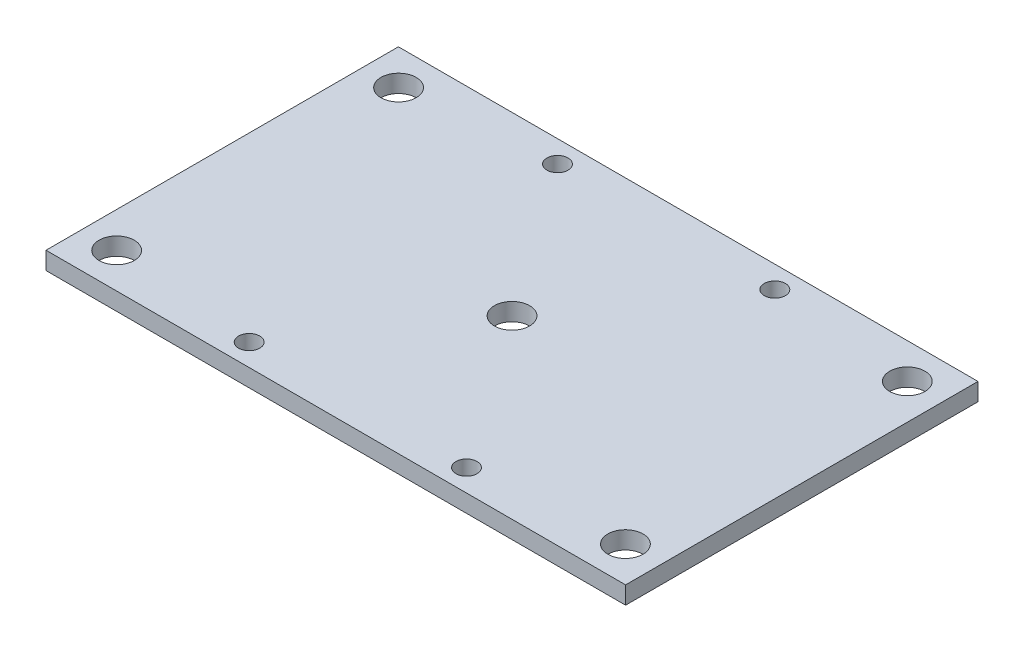
ISO-10303-21;
HEADER;
FILE_DESCRIPTION(('STEP AP214'),'2;1');
FILE_NAME('part.step','',(''),(''),'','','');
FILE_SCHEMA(('AUTOMOTIVE_DESIGN { 1 0 10303 214 1 1 1 1 }'));
ENDSEC;
DATA;
#1=APPLICATION_CONTEXT('core data for automotive mechanical design processes');
#2=APPLICATION_PROTOCOL_DEFINITION('international standard','automotive_design',2000,#1);
#3=PRODUCT_CONTEXT('',#1,'mechanical');
#4=PRODUCT('Part','Part','',(#3));
#5=PRODUCT_RELATED_PRODUCT_CATEGORY('part','',(#4));
#6=PRODUCT_DEFINITION_FORMATION('','',#4);
#7=PRODUCT_DEFINITION_CONTEXT('part definition',#1,'design');
#8=PRODUCT_DEFINITION('design','',#6,#7);
#9=PRODUCT_DEFINITION_SHAPE('','',#8);
#10=(LENGTH_UNIT() NAMED_UNIT(*) SI_UNIT(.MILLI.,.METRE.));
#11=(NAMED_UNIT(*) PLANE_ANGLE_UNIT() SI_UNIT($,.RADIAN.));
#12=(NAMED_UNIT(*) SI_UNIT($,.STERADIAN.) SOLID_ANGLE_UNIT());
#13=UNCERTAINTY_MEASURE_WITH_UNIT(LENGTH_MEASURE(1.E-05),#10,'distance_accuracy_value','');
#14=(GEOMETRIC_REPRESENTATION_CONTEXT(3) GLOBAL_UNCERTAINTY_ASSIGNED_CONTEXT((#13)) GLOBAL_UNIT_ASSIGNED_CONTEXT((#10,
#11,#12)) REPRESENTATION_CONTEXT('',''));
#15=CARTESIAN_POINT('',(0.,0.,0.));
#16=DIRECTION('',(0.,0.,1.));
#17=DIRECTION('',(1.,0.,0.));
#18=AXIS2_PLACEMENT_3D('',#15,#16,#17);
#19=CARTESIAN_POINT('',(0.,5.,0.));
#20=DIRECTION('',(0.,-1.,0.));
#21=DIRECTION('',(0.,0.,-1.));
#22=AXIS2_PLACEMENT_3D('',#19,#20,#21);
#23=PLANE('',#22);
#24=CARTESIAN_POINT('',(-30.8390624999998,5.,43.7499999999999));
#25=DIRECTION('',(0.,1.,0.));
#26=DIRECTION('',(0.,0.,-1.));
#27=AXIS2_PLACEMENT_3D('',#24,#25,#26);
#28=CIRCLE('',#27,3.);
#29=CARTESIAN_POINT('',(-30.8390624999998,5.,46.7499999999999));
#30=VERTEX_POINT('',#29);
#31=EDGE_CURVE('E157',#30,#30,#28,.T.);
#32=ORIENTED_EDGE('',*,*,#31,.F.);
#33=EDGE_LOOP('',(#32));
#34=FACE_BOUND('',#33,.T.);
#35=CARTESIAN_POINT('',(30.8390625,5.,43.7499999999998));
#36=DIRECTION('',(0.,1.,0.));
#37=DIRECTION('',(0.,0.,1.));
#38=AXIS2_PLACEMENT_3D('',#35,#36,#37);
#39=CIRCLE('',#38,3.);
#40=CARTESIAN_POINT('',(30.8390625,5.,46.7499999999998));
#41=VERTEX_POINT('',#40);
#42=EDGE_CURVE('E151',#41,#41,#39,.T.);
#43=ORIENTED_EDGE('',*,*,#42,.F.);
#44=EDGE_LOOP('',(#43));
#45=FACE_BOUND('',#44,.T.);
#46=CARTESIAN_POINT('',(30.8390625,5.,-43.7499999999998));
#47=DIRECTION('',(0.,1.,0.));
#48=DIRECTION('',(0.,0.,-1.));
#49=AXIS2_PLACEMENT_3D('',#46,#47,#48);
#50=CIRCLE('',#49,3.);
#51=CARTESIAN_POINT('',(30.8390625,5.,-40.7499999999998));
#52=VERTEX_POINT('',#51);
#53=EDGE_CURVE('E145',#52,#52,#50,.T.);
#54=ORIENTED_EDGE('',*,*,#53,.F.);
#55=EDGE_LOOP('',(#54));
#56=FACE_BOUND('',#55,.T.);
#57=CARTESIAN_POINT('',(-30.8390624999998,5.,-43.7499999999999));
#58=DIRECTION('',(0.,1.,0.));
#59=DIRECTION('',(0.,0.,1.));
#60=AXIS2_PLACEMENT_3D('',#57,#58,#59);
#61=CIRCLE('',#60,3.);
#62=CARTESIAN_POINT('',(-30.8390624999998,5.,-40.7499999999999));
#63=VERTEX_POINT('',#62);
#64=EDGE_CURVE('E139',#63,#63,#61,.T.);
#65=ORIENTED_EDGE('',*,*,#64,.F.);
#66=EDGE_LOOP('',(#65));
#67=FACE_BOUND('',#66,.T.);
#68=DIRECTION('',(1.,0.,0.));
#69=VECTOR('',#68,1.);
#70=CARTESIAN_POINT('',(-90.2374999999999,5.,50.));
#71=LINE('',#70,#69);
#72=CARTESIAN_POINT('',(-82.2374999999999,5.,50.));
#73=VERTEX_POINT('',#72);
#74=CARTESIAN_POINT('',(82.2374999999998,5.,50.));
#75=VERTEX_POINT('',#74);
#76=EDGE_CURVE('E11',#73,#75,#71,.T.);
#77=ORIENTED_EDGE('',*,*,#76,.T.);
#78=DIRECTION('',(0.,0.,1.));
#79=VECTOR('',#78,1.);
#80=CARTESIAN_POINT('',(82.2375000000001,5.,-49.9999999999998));
#81=LINE('',#80,#79);
#82=CARTESIAN_POINT('',(82.2375000000001,5.,-49.9999999999998));
#83=VERTEX_POINT('',#82);
#84=EDGE_CURVE('E50',#83,#75,#81,.T.);
#85=ORIENTED_EDGE('',*,*,#84,.F.);
#86=DIRECTION('',(-1.,0.,0.));
#87=VECTOR('',#86,1.);
#88=CARTESIAN_POINT('',(-90.2374999999999,5.,-50.));
#89=LINE('',#88,#87);
#90=CARTESIAN_POINT('',(-82.2374999999999,5.,-50.));
#91=VERTEX_POINT('',#90);
#92=EDGE_CURVE('E42',#83,#91,#89,.T.);
#93=ORIENTED_EDGE('',*,*,#92,.T.);
#94=DIRECTION('',(0.,0.,-1.));
#95=VECTOR('',#94,1.);
#96=CARTESIAN_POINT('',(-82.2374999999999,5.,-50.));
#97=LINE('',#96,#95);
#98=EDGE_CURVE('E129',#73,#91,#97,.T.);
#99=ORIENTED_EDGE('',*,*,#98,.F.);
#100=EDGE_LOOP('',(#77,#85,#93,#99));
#101=FACE_BOUND('',#100,.T.);
#102=CARTESIAN_POINT('',(-72.19,5.,-40.));
#103=DIRECTION('',(0.,1.,0.));
#104=DIRECTION('',(0.,0.,1.));
#105=AXIS2_PLACEMENT_3D('',#102,#103,#104);
#106=CIRCLE('',#105,5.00000000000001);
#107=CARTESIAN_POINT('',(-72.19,5.,-35.));
#108=VERTEX_POINT('',#107);
#109=EDGE_CURVE('E94',#108,#108,#106,.T.);
#110=ORIENTED_EDGE('',*,*,#109,.F.);
#111=EDGE_LOOP('',(#110));
#112=FACE_BOUND('',#111,.T.);
#113=CARTESIAN_POINT('',(72.19,5.,-40.));
#114=DIRECTION('',(0.,1.,0.));
#115=DIRECTION('',(0.,0.,-1.));
#116=AXIS2_PLACEMENT_3D('',#113,#114,#115);
#117=CIRCLE('',#116,5.00000000000001);
#118=CARTESIAN_POINT('',(72.19,5.,-45.));
#119=VERTEX_POINT('',#118);
#120=EDGE_CURVE('E102',#119,#119,#117,.T.);
#121=ORIENTED_EDGE('',*,*,#120,.F.);
#122=EDGE_LOOP('',(#121));
#123=FACE_BOUND('',#122,.T.);
#124=CARTESIAN_POINT('',(72.19,5.,40.));
#125=DIRECTION('',(0.,1.,0.));
#126=DIRECTION('',(0.,0.,1.));
#127=AXIS2_PLACEMENT_3D('',#124,#125,#126);
#128=CIRCLE('',#127,5.00000000000001);
#129=CARTESIAN_POINT('',(72.19,5.,45.));
#130=VERTEX_POINT('',#129);
#131=EDGE_CURVE('E107',#130,#130,#128,.T.);
#132=ORIENTED_EDGE('',*,*,#131,.F.);
#133=EDGE_LOOP('',(#132));
#134=FACE_BOUND('',#133,.T.);
#135=CARTESIAN_POINT('',(-72.19,5.,40.));
#136=DIRECTION('',(0.,1.,0.));
#137=DIRECTION('',(0.,0.,-1.));
#138=AXIS2_PLACEMENT_3D('',#135,#136,#137);
#139=CIRCLE('',#138,5.00000000000001);
#140=CARTESIAN_POINT('',(-72.19,5.,35.));
#141=VERTEX_POINT('',#140);
#142=EDGE_CURVE('E113',#141,#141,#139,.T.);
#143=ORIENTED_EDGE('',*,*,#142,.F.);
#144=EDGE_LOOP('',(#143));
#145=FACE_BOUND('',#144,.T.);
#146=CARTESIAN_POINT('',(0.,5.,0.));
#147=DIRECTION('',(0.,1.,0.));
#148=DIRECTION('',(0.,0.,1.));
#149=AXIS2_PLACEMENT_3D('',#146,#147,#148);
#150=CIRCLE('',#149,5.);
#151=CARTESIAN_POINT('',(0.,5.,4.99999999999999));
#152=VERTEX_POINT('',#151);
#153=EDGE_CURVE('E119',#152,#152,#150,.T.);
#154=ORIENTED_EDGE('',*,*,#153,.F.);
#155=EDGE_LOOP('',(#154));
#156=FACE_BOUND('',#155,.T.);
#157=ADVANCED_FACE('F33',(#34,#45,#56,#67,#101,#112,#123,#134,#145,#156),#23,.F.);
#158=CARTESIAN_POINT('',(0.,0.,0.));
#159=DIRECTION('',(0.,-1.,0.));
#160=DIRECTION('',(0.,0.,-1.));
#161=AXIS2_PLACEMENT_3D('',#158,#159,#160);
#162=PLANE('',#161);
#163=CARTESIAN_POINT('',(-30.8390624999998,0.,43.7499999999999));
#164=DIRECTION('',(0.,-1.,0.));
#165=DIRECTION('',(0.,0.,-1.));
#166=AXIS2_PLACEMENT_3D('',#163,#164,#165);
#167=CIRCLE('',#166,3.);
#168=CARTESIAN_POINT('',(-30.8390624999998,0.,46.7499999999999));
#169=VERTEX_POINT('',#168);
#170=EDGE_CURVE('E154',#169,#169,#167,.F.);
#171=ORIENTED_EDGE('',*,*,#170,.T.);
#172=EDGE_LOOP('',(#171));
#173=FACE_BOUND('',#172,.T.);
#174=CARTESIAN_POINT('',(30.8390625,0.,43.7499999999998));
#175=DIRECTION('',(0.,-1.,0.));
#176=DIRECTION('',(0.,0.,-1.));
#177=AXIS2_PLACEMENT_3D('',#174,#175,#176);
#178=CIRCLE('',#177,3.);
#179=CARTESIAN_POINT('',(30.8390625,0.,46.7499999999998));
#180=VERTEX_POINT('',#179);
#181=EDGE_CURVE('E148',#180,#180,#178,.F.);
#182=ORIENTED_EDGE('',*,*,#181,.T.);
#183=EDGE_LOOP('',(#182));
#184=FACE_BOUND('',#183,.T.);
#185=CARTESIAN_POINT('',(30.8390625,0.,-43.7499999999998));
#186=DIRECTION('',(0.,-1.,0.));
#187=DIRECTION('',(0.,0.,-1.));
#188=AXIS2_PLACEMENT_3D('',#185,#186,#187);
#189=CIRCLE('',#188,3.);
#190=CARTESIAN_POINT('',(30.8390625,0.,-40.7499999999998));
#191=VERTEX_POINT('',#190);
#192=EDGE_CURVE('E142',#191,#191,#189,.F.);
#193=ORIENTED_EDGE('',*,*,#192,.T.);
#194=EDGE_LOOP('',(#193));
#195=FACE_BOUND('',#194,.T.);
#196=CARTESIAN_POINT('',(-30.8390624999998,0.,-43.7499999999999));
#197=DIRECTION('',(0.,-1.,0.));
#198=DIRECTION('',(0.,0.,-1.));
#199=AXIS2_PLACEMENT_3D('',#196,#197,#198);
#200=CIRCLE('',#199,3.);
#201=CARTESIAN_POINT('',(-30.8390624999998,0.,-40.7499999999999));
#202=VERTEX_POINT('',#201);
#203=EDGE_CURVE('E136',#202,#202,#200,.F.);
#204=ORIENTED_EDGE('',*,*,#203,.T.);
#205=EDGE_LOOP('',(#204));
#206=FACE_BOUND('',#205,.T.);
#207=DIRECTION('',(0.,0.,1.));
#208=VECTOR('',#207,1.);
#209=CARTESIAN_POINT('',(82.2375000000001,0.,-49.9999999999998));
#210=LINE('',#209,#208);
#211=CARTESIAN_POINT('',(82.2375000000001,0.,-49.9999999999998));
#212=VERTEX_POINT('',#211);
#213=CARTESIAN_POINT('',(82.2374999999998,0.,50.0000000000002));
#214=VERTEX_POINT('',#213);
#215=EDGE_CURVE('E77',#212,#214,#210,.T.);
#216=ORIENTED_EDGE('',*,*,#215,.T.);
#217=DIRECTION('',(1.,0.,0.));
#218=VECTOR('',#217,1.);
#219=CARTESIAN_POINT('',(-90.2374999999999,0.,50.));
#220=LINE('',#219,#218);
#221=CARTESIAN_POINT('',(-82.2374999999999,0.,50.));
#222=VERTEX_POINT('',#221);
#223=EDGE_CURVE('E37',#222,#214,#220,.T.);
#224=ORIENTED_EDGE('',*,*,#223,.F.);
#225=DIRECTION('',(0.,0.,-1.));
#226=VECTOR('',#225,1.);
#227=CARTESIAN_POINT('',(-82.2374999999999,0.,-50.));
#228=LINE('',#227,#226);
#229=CARTESIAN_POINT('',(-82.2374999999999,0.,-50.));
#230=VERTEX_POINT('',#229);
#231=EDGE_CURVE('E58',#222,#230,#228,.T.);
#232=ORIENTED_EDGE('',*,*,#231,.T.);
#233=DIRECTION('',(-1.,0.,0.));
#234=VECTOR('',#233,1.);
#235=CARTESIAN_POINT('',(-90.2374999999999,0.,-50.));
#236=LINE('',#235,#234);
#237=EDGE_CURVE('E89',#212,#230,#236,.T.);
#238=ORIENTED_EDGE('',*,*,#237,.F.);
#239=EDGE_LOOP('',(#216,#224,#232,#238));
#240=FACE_BOUND('',#239,.T.);
#241=CARTESIAN_POINT('',(-72.19,0.,40.));
#242=DIRECTION('',(0.,1.,0.));
#243=DIRECTION('',(0.,0.,-1.));
#244=AXIS2_PLACEMENT_3D('',#241,#242,#243);
#245=CIRCLE('',#244,5.00000000000001);
#246=CARTESIAN_POINT('',(-72.19,0.,35.));
#247=VERTEX_POINT('',#246);
#248=EDGE_CURVE('E116',#247,#247,#245,.T.);
#249=ORIENTED_EDGE('',*,*,#248,.T.);
#250=EDGE_LOOP('',(#249));
#251=FACE_BOUND('',#250,.T.);
#252=CARTESIAN_POINT('',(72.19,0.,-40.));
#253=DIRECTION('',(0.,1.,0.));
#254=DIRECTION('',(0.,0.,-1.));
#255=AXIS2_PLACEMENT_3D('',#252,#253,#254);
#256=CIRCLE('',#255,5.00000000000001);
#257=CARTESIAN_POINT('',(72.19,0.,-45.));
#258=VERTEX_POINT('',#257);
#259=EDGE_CURVE('E104',#258,#258,#256,.T.);
#260=ORIENTED_EDGE('',*,*,#259,.T.);
#261=EDGE_LOOP('',(#260));
#262=FACE_BOUND('',#261,.T.);
#263=CARTESIAN_POINT('',(-72.19,0.,-40.));
#264=DIRECTION('',(0.,1.,0.));
#265=DIRECTION('',(0.,0.,1.));
#266=AXIS2_PLACEMENT_3D('',#263,#264,#265);
#267=CIRCLE('',#266,5.00000000000001);
#268=CARTESIAN_POINT('',(-72.19,0.,-35.));
#269=VERTEX_POINT('',#268);
#270=EDGE_CURVE('E98',#269,#269,#267,.T.);
#271=ORIENTED_EDGE('',*,*,#270,.T.);
#272=EDGE_LOOP('',(#271));
#273=FACE_BOUND('',#272,.T.);
#274=CARTESIAN_POINT('',(72.19,0.,40.));
#275=DIRECTION('',(0.,1.,0.));
#276=DIRECTION('',(0.,0.,1.));
#277=AXIS2_PLACEMENT_3D('',#274,#275,#276);
#278=CIRCLE('',#277,5.00000000000001);
#279=CARTESIAN_POINT('',(72.19,0.,45.));
#280=VERTEX_POINT('',#279);
#281=EDGE_CURVE('E110',#280,#280,#278,.T.);
#282=ORIENTED_EDGE('',*,*,#281,.T.);
#283=EDGE_LOOP('',(#282));
#284=FACE_BOUND('',#283,.T.);
#285=CARTESIAN_POINT('',(0.,0.,0.));
#286=DIRECTION('',(0.,1.,0.));
#287=DIRECTION('',(0.,0.,1.));
#288=AXIS2_PLACEMENT_3D('',#285,#286,#287);
#289=CIRCLE('',#288,5.);
#290=CARTESIAN_POINT('',(0.,0.,4.99999999999999));
#291=VERTEX_POINT('',#290);
#292=EDGE_CURVE('E122',#291,#291,#289,.T.);
#293=ORIENTED_EDGE('',*,*,#292,.T.);
#294=EDGE_LOOP('',(#293));
#295=FACE_BOUND('',#294,.T.);
#296=ADVANCED_FACE('F87',(#173,#184,#195,#206,#240,#251,#262,#273,#284,#295),#162,.T.);
#297=CARTESIAN_POINT('',(-90.2374999999999,5.,-50.));
#298=DIRECTION('',(0.,0.,1.));
#299=DIRECTION('',(1.,0.,0.));
#300=AXIS2_PLACEMENT_3D('',#297,#298,#299);
#301=PLANE('',#300);
#302=ORIENTED_EDGE('',*,*,#92,.F.);
#303=DIRECTION('',(0.,1.,0.));
#304=VECTOR('',#303,1.);
#305=CARTESIAN_POINT('',(82.2375000000001,-100.319489631876,-49.9999999999998));
#306=LINE('',#305,#304);
#307=EDGE_CURVE('E82',#212,#83,#306,.T.);
#308=ORIENTED_EDGE('',*,*,#307,.F.);
#309=ORIENTED_EDGE('',*,*,#237,.T.);
#310=DIRECTION('',(0.,1.,0.));
#311=VECTOR('',#310,1.);
#312=CARTESIAN_POINT('',(-82.2374999999999,-100.319489631876,-50.));
#313=LINE('',#312,#311);
#314=EDGE_CURVE('E125',#230,#91,#313,.T.);
#315=ORIENTED_EDGE('',*,*,#314,.T.);
#316=EDGE_LOOP('',(#302,#308,#309,#315));
#317=FACE_BOUND('',#316,.T.);
#318=ADVANCED_FACE('F35',(#317),#301,.F.);
#319=CARTESIAN_POINT('',(-90.2374999999999,5.,50.));
#320=DIRECTION('',(0.,0.,-1.));
#321=DIRECTION('',(-1.,0.,0.));
#322=AXIS2_PLACEMENT_3D('',#319,#320,#321);
#323=PLANE('',#322);
#324=ORIENTED_EDGE('',*,*,#223,.T.);
#325=DIRECTION('',(0.,1.,0.));
#326=VECTOR('',#325,1.);
#327=CARTESIAN_POINT('',(82.2374999999998,-100.319489631876,50.0000000000002));
#328=LINE('',#327,#326);
#329=EDGE_CURVE('E74',#214,#75,#328,.T.);
#330=ORIENTED_EDGE('',*,*,#329,.T.);
#331=ORIENTED_EDGE('',*,*,#76,.F.);
#332=DIRECTION('',(0.,1.,0.));
#333=VECTOR('',#332,1.);
#334=CARTESIAN_POINT('',(-82.2374999999999,-100.319489631876,50.));
#335=LINE('',#334,#333);
#336=EDGE_CURVE('E92',#222,#73,#335,.T.);
#337=ORIENTED_EDGE('',*,*,#336,.F.);
#338=EDGE_LOOP('',(#324,#330,#331,#337));
#339=FACE_BOUND('',#338,.T.);
#340=ADVANCED_FACE('F91',(#339),#323,.F.);
#341=CARTESIAN_POINT('',(-72.19,5.,-40.));
#342=DIRECTION('',(0.,-1.,0.));
#343=DIRECTION('',(0.,0.,-1.));
#344=AXIS2_PLACEMENT_3D('',#341,#342,#343);
#345=CYLINDRICAL_SURFACE('',#344,5.00000000000001);
#346=ORIENTED_EDGE('',*,*,#109,.T.);
#347=EDGE_LOOP('',(#346));
#348=FACE_BOUND('',#347,.T.);
#349=ORIENTED_EDGE('',*,*,#270,.F.);
#350=EDGE_LOOP('',(#349));
#351=FACE_BOUND('',#350,.T.);
#352=ADVANCED_FACE('F203',(#348,#351),#345,.F.);
#353=CARTESIAN_POINT('',(72.19,5.,-40.));
#354=DIRECTION('',(0.,-1.,0.));
#355=DIRECTION('',(0.,0.,-1.));
#356=AXIS2_PLACEMENT_3D('',#353,#354,#355);
#357=CYLINDRICAL_SURFACE('',#356,5.00000000000001);
#358=ORIENTED_EDGE('',*,*,#120,.T.);
#359=EDGE_LOOP('',(#358));
#360=FACE_BOUND('',#359,.T.);
#361=ORIENTED_EDGE('',*,*,#259,.F.);
#362=EDGE_LOOP('',(#361));
#363=FACE_BOUND('',#362,.T.);
#364=ADVANCED_FACE('F208',(#360,#363),#357,.F.);
#365=CARTESIAN_POINT('',(72.19,5.,40.));
#366=DIRECTION('',(0.,-1.,0.));
#367=DIRECTION('',(0.,0.,-1.));
#368=AXIS2_PLACEMENT_3D('',#365,#366,#367);
#369=CYLINDRICAL_SURFACE('',#368,5.00000000000001);
#370=ORIENTED_EDGE('',*,*,#131,.T.);
#371=EDGE_LOOP('',(#370));
#372=FACE_BOUND('',#371,.T.);
#373=ORIENTED_EDGE('',*,*,#281,.F.);
#374=EDGE_LOOP('',(#373));
#375=FACE_BOUND('',#374,.T.);
#376=ADVANCED_FACE('F213',(#372,#375),#369,.F.);
#377=CARTESIAN_POINT('',(-72.19,5.,40.));
#378=DIRECTION('',(0.,-1.,0.));
#379=DIRECTION('',(0.,0.,-1.));
#380=AXIS2_PLACEMENT_3D('',#377,#378,#379);
#381=CYLINDRICAL_SURFACE('',#380,5.00000000000001);
#382=ORIENTED_EDGE('',*,*,#142,.T.);
#383=EDGE_LOOP('',(#382));
#384=FACE_BOUND('',#383,.T.);
#385=ORIENTED_EDGE('',*,*,#248,.F.);
#386=EDGE_LOOP('',(#385));
#387=FACE_BOUND('',#386,.T.);
#388=ADVANCED_FACE('F189',(#384,#387),#381,.F.);
#389=CARTESIAN_POINT('',(0.,5.,0.));
#390=DIRECTION('',(0.,-1.,0.));
#391=DIRECTION('',(0.,0.,-1.));
#392=AXIS2_PLACEMENT_3D('',#389,#390,#391);
#393=CYLINDRICAL_SURFACE('',#392,5.);
#394=ORIENTED_EDGE('',*,*,#153,.T.);
#395=EDGE_LOOP('',(#394));
#396=FACE_BOUND('',#395,.T.);
#397=ORIENTED_EDGE('',*,*,#292,.F.);
#398=EDGE_LOOP('',(#397));
#399=FACE_BOUND('',#398,.T.);
#400=ADVANCED_FACE('F185',(#396,#399),#393,.F.);
#401=CARTESIAN_POINT('',(-82.2374999999999,-100.319489631876,-50.));
#402=DIRECTION('',(1.,0.,0.));
#403=DIRECTION('',(0.,0.,-1.));
#404=AXIS2_PLACEMENT_3D('',#401,#402,#403);
#405=PLANE('',#404);
#406=ORIENTED_EDGE('',*,*,#336,.T.);
#407=ORIENTED_EDGE('',*,*,#98,.T.);
#408=ORIENTED_EDGE('',*,*,#314,.F.);
#409=ORIENTED_EDGE('',*,*,#231,.F.);
#410=EDGE_LOOP('',(#406,#407,#408,#409));
#411=FACE_BOUND('',#410,.T.);
#412=ADVANCED_FACE('F188',(#411),#405,.F.);
#413=CARTESIAN_POINT('',(82.2375000000001,-100.319489631876,-49.9999999999998));
#414=DIRECTION('',(-1.,0.,0.));
#415=DIRECTION('',(0.,0.,1.));
#416=AXIS2_PLACEMENT_3D('',#413,#414,#415);
#417=PLANE('',#416);
#418=ORIENTED_EDGE('',*,*,#307,.T.);
#419=ORIENTED_EDGE('',*,*,#84,.T.);
#420=ORIENTED_EDGE('',*,*,#329,.F.);
#421=ORIENTED_EDGE('',*,*,#215,.F.);
#422=EDGE_LOOP('',(#418,#419,#420,#421));
#423=FACE_BOUND('',#422,.T.);
#424=ADVANCED_FACE('F76',(#423),#417,.F.);
#425=CARTESIAN_POINT('',(-30.8390624999998,-8.48528137423856,-43.7499999999999));
#426=DIRECTION('',(0.,1.,0.));
#427=DIRECTION('',(0.,0.,1.));
#428=AXIS2_PLACEMENT_3D('',#425,#426,#427);
#429=CYLINDRICAL_SURFACE('',#428,3.);
#430=CARTESIAN_POINT('',(-30.8390624999998,5.,-40.7499999999999));
#431=CARTESIAN_POINT('',(-30.8390624999998,4.94791666666667,-40.7499999999999));
#432=CARTESIAN_POINT('',(-30.8390624999998,4.89583333333333,-40.7499999999999));
#433=CARTESIAN_POINT('',(-30.8390624999998,4.79166666666667,-40.7499999999999));
#434=CARTESIAN_POINT('',(-30.8390624999998,4.73958333333333,-40.7499999999999));
#435=CARTESIAN_POINT('',(-30.8390624999998,4.63541666666667,-40.7499999999999));
#436=CARTESIAN_POINT('',(-30.8390624999998,4.58333333333333,-40.7499999999999));
#437=CARTESIAN_POINT('',(-30.8390624999998,4.47916666666667,-40.7499999999999));
#438=CARTESIAN_POINT('',(-30.8390624999998,4.42708333333333,-40.7499999999999));
#439=CARTESIAN_POINT('',(-30.8390624999998,4.32291666666667,-40.7499999999999));
#440=CARTESIAN_POINT('',(-30.8390624999998,4.27083333333333,-40.7499999999999));
#441=CARTESIAN_POINT('',(-30.8390624999998,4.16666666666667,-40.7499999999999));
#442=CARTESIAN_POINT('',(-30.8390624999998,4.11458333333333,-40.7499999999999));
#443=CARTESIAN_POINT('',(-30.8390624999998,4.01041666666667,-40.7499999999999));
#444=CARTESIAN_POINT('',(-30.8390624999998,3.95833333333333,-40.7499999999999));
#445=CARTESIAN_POINT('',(-30.8390624999998,3.85416666666667,-40.7499999999999));
#446=CARTESIAN_POINT('',(-30.8390624999998,3.80208333333333,-40.7499999999999));
#447=CARTESIAN_POINT('',(-30.8390624999998,3.69791666666667,-40.7499999999999));
#448=CARTESIAN_POINT('',(-30.8390624999998,3.64583333333333,-40.7499999999999));
#449=CARTESIAN_POINT('',(-30.8390624999998,3.54166666666667,-40.7499999999999));
#450=CARTESIAN_POINT('',(-30.8390624999998,3.48958333333333,-40.7499999999999));
#451=CARTESIAN_POINT('',(-30.8390624999998,3.38541666666667,-40.7499999999999));
#452=CARTESIAN_POINT('',(-30.8390624999998,3.33333333333333,-40.7499999999999));
#453=CARTESIAN_POINT('',(-30.8390624999998,3.22916666666667,-40.7499999999999));
#454=CARTESIAN_POINT('',(-30.8390624999998,3.17708333333333,-40.7499999999999));
#455=CARTESIAN_POINT('',(-30.8390624999998,3.07291666666667,-40.7499999999999));
#456=CARTESIAN_POINT('',(-30.8390624999998,3.02083333333333,-40.7499999999999));
#457=CARTESIAN_POINT('',(-30.8390624999998,2.91666666666667,-40.7499999999999));
#458=CARTESIAN_POINT('',(-30.8390624999998,2.86458333333333,-40.7499999999999));
#459=CARTESIAN_POINT('',(-30.8390624999998,2.76041666666667,-40.7499999999999));
#460=CARTESIAN_POINT('',(-30.8390624999998,2.70833333333333,-40.7499999999999));
#461=CARTESIAN_POINT('',(-30.8390624999998,2.60416666666667,-40.7499999999999));
#462=CARTESIAN_POINT('',(-30.8390624999998,2.55208333333333,-40.7499999999999));
#463=CARTESIAN_POINT('',(-30.8390624999998,2.44791666666667,-40.7499999999999));
#464=CARTESIAN_POINT('',(-30.8390624999998,2.39583333333333,-40.7499999999999));
#465=CARTESIAN_POINT('',(-30.8390624999998,2.29166666666667,-40.7499999999999));
#466=CARTESIAN_POINT('',(-30.8390624999998,2.23958333333333,-40.7499999999999));
#467=CARTESIAN_POINT('',(-30.8390624999998,2.13541666666667,-40.7499999999999));
#468=CARTESIAN_POINT('',(-30.8390624999998,2.08333333333333,-40.7499999999999));
#469=CARTESIAN_POINT('',(-30.8390624999998,1.97916666666667,-40.7499999999999));
#470=CARTESIAN_POINT('',(-30.8390624999998,1.92708333333333,-40.7499999999999));
#471=CARTESIAN_POINT('',(-30.8390624999998,1.82291666666667,-40.7499999999999));
#472=CARTESIAN_POINT('',(-30.8390624999998,1.77083333333333,-40.7499999999999));
#473=CARTESIAN_POINT('',(-30.8390624999998,1.66666666666667,-40.7499999999999));
#474=CARTESIAN_POINT('',(-30.8390624999998,1.61458333333333,-40.7499999999999));
#475=CARTESIAN_POINT('',(-30.8390624999998,1.51041666666667,-40.7499999999999));
#476=CARTESIAN_POINT('',(-30.8390624999998,1.45833333333333,-40.7499999999999));
#477=CARTESIAN_POINT('',(-30.8390624999998,1.35416666666667,-40.7499999999999));
#478=CARTESIAN_POINT('',(-30.8390624999998,1.30208333333333,-40.7499999999999));
#479=CARTESIAN_POINT('',(-30.8390624999998,1.19791666666667,-40.7499999999999));
#480=CARTESIAN_POINT('',(-30.8390624999998,1.14583333333333,-40.7499999999999));
#481=CARTESIAN_POINT('',(-30.8390624999998,1.04166666666667,-40.7499999999999));
#482=CARTESIAN_POINT('',(-30.8390624999998,0.989583333333334,-40.7499999999999));
#483=CARTESIAN_POINT('',(-30.8390624999998,0.885416666666668,-40.7499999999999));
#484=CARTESIAN_POINT('',(-30.8390624999998,0.833333333333335,-40.7499999999999));
#485=CARTESIAN_POINT('',(-30.8390624999998,0.729166666666669,-40.7499999999999));
#486=CARTESIAN_POINT('',(-30.8390624999998,0.677083333333336,-40.7499999999999));
#487=CARTESIAN_POINT('',(-30.8390624999998,0.572916666666669,-40.7499999999999));
#488=CARTESIAN_POINT('',(-30.8390624999998,0.520833333333335,-40.7499999999999));
#489=CARTESIAN_POINT('',(-30.8390624999998,0.416666666666669,-40.7499999999999));
#490=CARTESIAN_POINT('',(-30.8390624999998,0.364583333333335,-40.7499999999999));
#491=CARTESIAN_POINT('',(-30.8390624999998,0.260416666666669,-40.7499999999999));
#492=CARTESIAN_POINT('',(-30.8390624999998,0.208333333333335,-40.7499999999999));
#493=CARTESIAN_POINT('',(-30.8390624999998,0.104166666666669,-40.7499999999999));
#494=CARTESIAN_POINT('',(-30.8390624999998,0.0520833333333352,-40.7499999999999));
#495=CARTESIAN_POINT('',(-30.8390624999998,0.,-40.7499999999999));
#496=B_SPLINE_CURVE_WITH_KNOTS('',3,(#430,#431,#432,#433,#434,#435,#436,#437,#438,#439,#440,
#441,#442,#443,#444,#445,#446,#447,#448,#449,#450,#451,#452,#453,#454,#455,#456,#457,#458,#459,
#460,#461,#462,#463,#464,#465,#466,#467,#468,#469,#470,#471,#472,#473,#474,#475,#476,#477,#478,
#479,#480,#481,#482,#483,#484,#485,#486,#487,#488,#489,#490,#491,#492,#493,#494,#495),
.UNSPECIFIED.,.F.,.F.,(4,2,2,2,2,2,2,2,2,2,2,2,2,2,2,2,2,2,2,2,2,2,2,2,2,2,2,2,2,2,2,2,4),(0.,
0.15625,0.3125,0.46875,0.625000000000001,0.781249999999999,0.937499999999999,1.09375,1.25,
1.40625,1.5625,1.71875,1.875,2.03125,2.1875,2.34375,2.5,2.65625,2.8125,2.96875,3.125,3.28125,
3.4375,3.59375,3.75,3.90625,4.0625,4.21875,4.375,4.53125,4.6875,4.84375,5.),.UNSPECIFIED.);
#497=EDGE_CURVE('BSEAM228',#63,#202,#496,.T.);
#498=ORIENTED_EDGE('',*,*,#64,.T.);
#499=ORIENTED_EDGE('',*,*,#203,.F.);
#500=ORIENTED_EDGE('',*,*,#497,.T.);
#501=ORIENTED_EDGE('',*,*,#497,.F.);
#502=EDGE_LOOP('',(#498,#500,#499,#501));
#503=FACE_BOUND('',#502,.T.);
#504=ADVANCED_FACE('F228',(#503),#429,.F.);
#505=CARTESIAN_POINT('',(30.8390625,-8.48528137423856,-43.7499999999998));
#506=DIRECTION('',(0.,1.,0.));
#507=DIRECTION('',(0.,0.,1.));
#508=AXIS2_PLACEMENT_3D('',#505,#506,#507);
#509=CYLINDRICAL_SURFACE('',#508,3.);
#510=CARTESIAN_POINT('',(30.8390625,5.,-40.7499999999998));
#511=CARTESIAN_POINT('',(30.8390625,4.94791666666667,-40.7499999999998));
#512=CARTESIAN_POINT('',(30.8390625,4.89583333333333,-40.7499999999998));
#513=CARTESIAN_POINT('',(30.8390625,4.79166666666667,-40.7499999999998));
#514=CARTESIAN_POINT('',(30.8390625,4.73958333333333,-40.7499999999998));
#515=CARTESIAN_POINT('',(30.8390625,4.63541666666667,-40.7499999999998));
#516=CARTESIAN_POINT('',(30.8390625,4.58333333333333,-40.7499999999998));
#517=CARTESIAN_POINT('',(30.8390625,4.47916666666667,-40.7499999999998));
#518=CARTESIAN_POINT('',(30.8390625,4.42708333333333,-40.7499999999998));
#519=CARTESIAN_POINT('',(30.8390625,4.32291666666667,-40.7499999999998));
#520=CARTESIAN_POINT('',(30.8390625,4.27083333333333,-40.7499999999998));
#521=CARTESIAN_POINT('',(30.8390625,4.16666666666667,-40.7499999999998));
#522=CARTESIAN_POINT('',(30.8390625,4.11458333333333,-40.7499999999998));
#523=CARTESIAN_POINT('',(30.8390625,4.01041666666667,-40.7499999999998));
#524=CARTESIAN_POINT('',(30.8390625,3.95833333333333,-40.7499999999998));
#525=CARTESIAN_POINT('',(30.8390625,3.85416666666667,-40.7499999999998));
#526=CARTESIAN_POINT('',(30.8390625,3.80208333333333,-40.7499999999998));
#527=CARTESIAN_POINT('',(30.8390625,3.69791666666667,-40.7499999999998));
#528=CARTESIAN_POINT('',(30.8390625,3.64583333333333,-40.7499999999998));
#529=CARTESIAN_POINT('',(30.8390625,3.54166666666667,-40.7499999999998));
#530=CARTESIAN_POINT('',(30.8390625,3.48958333333333,-40.7499999999998));
#531=CARTESIAN_POINT('',(30.8390625,3.38541666666667,-40.7499999999998));
#532=CARTESIAN_POINT('',(30.8390625,3.33333333333333,-40.7499999999998));
#533=CARTESIAN_POINT('',(30.8390625,3.22916666666667,-40.7499999999998));
#534=CARTESIAN_POINT('',(30.8390625,3.17708333333333,-40.7499999999998));
#535=CARTESIAN_POINT('',(30.8390625,3.07291666666667,-40.7499999999998));
#536=CARTESIAN_POINT('',(30.8390625,3.02083333333333,-40.7499999999998));
#537=CARTESIAN_POINT('',(30.8390625,2.91666666666667,-40.7499999999998));
#538=CARTESIAN_POINT('',(30.8390625,2.86458333333333,-40.7499999999998));
#539=CARTESIAN_POINT('',(30.8390625,2.76041666666667,-40.7499999999998));
#540=CARTESIAN_POINT('',(30.8390625,2.70833333333333,-40.7499999999998));
#541=CARTESIAN_POINT('',(30.8390625,2.60416666666667,-40.7499999999998));
#542=CARTESIAN_POINT('',(30.8390625,2.55208333333333,-40.7499999999998));
#543=CARTESIAN_POINT('',(30.8390625,2.44791666666667,-40.7499999999998));
#544=CARTESIAN_POINT('',(30.8390625,2.39583333333333,-40.7499999999998));
#545=CARTESIAN_POINT('',(30.8390625,2.29166666666667,-40.7499999999998));
#546=CARTESIAN_POINT('',(30.8390625,2.23958333333333,-40.7499999999998));
#547=CARTESIAN_POINT('',(30.8390625,2.13541666666667,-40.7499999999998));
#548=CARTESIAN_POINT('',(30.8390625,2.08333333333333,-40.7499999999998));
#549=CARTESIAN_POINT('',(30.8390625,1.97916666666667,-40.7499999999998));
#550=CARTESIAN_POINT('',(30.8390625,1.92708333333333,-40.7499999999998));
#551=CARTESIAN_POINT('',(30.8390625,1.82291666666667,-40.7499999999998));
#552=CARTESIAN_POINT('',(30.8390625,1.77083333333333,-40.7499999999998));
#553=CARTESIAN_POINT('',(30.8390625,1.66666666666667,-40.7499999999998));
#554=CARTESIAN_POINT('',(30.8390625,1.61458333333333,-40.7499999999998));
#555=CARTESIAN_POINT('',(30.8390625,1.51041666666667,-40.7499999999998));
#556=CARTESIAN_POINT('',(30.8390625,1.45833333333333,-40.7499999999998));
#557=CARTESIAN_POINT('',(30.8390625,1.35416666666667,-40.7499999999998));
#558=CARTESIAN_POINT('',(30.8390625,1.30208333333333,-40.7499999999998));
#559=CARTESIAN_POINT('',(30.8390625,1.19791666666667,-40.7499999999998));
#560=CARTESIAN_POINT('',(30.8390625,1.14583333333333,-40.7499999999998));
#561=CARTESIAN_POINT('',(30.8390625,1.04166666666667,-40.7499999999998));
#562=CARTESIAN_POINT('',(30.8390625,0.989583333333334,-40.7499999999998));
#563=CARTESIAN_POINT('',(30.8390625,0.885416666666668,-40.7499999999998));
#564=CARTESIAN_POINT('',(30.8390625,0.833333333333335,-40.7499999999998));
#565=CARTESIAN_POINT('',(30.8390625,0.729166666666669,-40.7499999999998));
#566=CARTESIAN_POINT('',(30.8390625,0.677083333333336,-40.7499999999998));
#567=CARTESIAN_POINT('',(30.8390625,0.572916666666669,-40.7499999999998));
#568=CARTESIAN_POINT('',(30.8390625,0.520833333333335,-40.7499999999998));
#569=CARTESIAN_POINT('',(30.8390625,0.416666666666669,-40.7499999999998));
#570=CARTESIAN_POINT('',(30.8390625,0.364583333333335,-40.7499999999998));
#571=CARTESIAN_POINT('',(30.8390625,0.260416666666669,-40.7499999999998));
#572=CARTESIAN_POINT('',(30.8390625,0.208333333333335,-40.7499999999998));
#573=CARTESIAN_POINT('',(30.8390625,0.104166666666669,-40.7499999999998));
#574=CARTESIAN_POINT('',(30.8390625,0.0520833333333352,-40.7499999999998));
#575=CARTESIAN_POINT('',(30.8390625,0.,-40.7499999999998));
#576=B_SPLINE_CURVE_WITH_KNOTS('',3,(#510,#511,#512,#513,#514,#515,#516,#517,#518,#519,#520,
#521,#522,#523,#524,#525,#526,#527,#528,#529,#530,#531,#532,#533,#534,#535,#536,#537,#538,#539,
#540,#541,#542,#543,#544,#545,#546,#547,#548,#549,#550,#551,#552,#553,#554,#555,#556,#557,#558,
#559,#560,#561,#562,#563,#564,#565,#566,#567,#568,#569,#570,#571,#572,#573,#574,#575),
.UNSPECIFIED.,.F.,.F.,(4,2,2,2,2,2,2,2,2,2,2,2,2,2,2,2,2,2,2,2,2,2,2,2,2,2,2,2,2,2,2,2,4),(0.,
0.15625,0.3125,0.46875,0.625000000000001,0.781249999999999,0.937499999999999,1.09375,1.25,
1.40625,1.5625,1.71875,1.875,2.03125,2.1875,2.34375,2.5,2.65625,2.8125,2.96875,3.125,3.28125,
3.4375,3.59375,3.75,3.90625,4.0625,4.21875,4.375,4.53125,4.6875,4.84375,5.),.UNSPECIFIED.);
#577=EDGE_CURVE('BSEAM231',#52,#191,#576,.T.);
#578=ORIENTED_EDGE('',*,*,#53,.T.);
#579=ORIENTED_EDGE('',*,*,#192,.F.);
#580=ORIENTED_EDGE('',*,*,#577,.T.);
#581=ORIENTED_EDGE('',*,*,#577,.F.);
#582=EDGE_LOOP('',(#578,#580,#579,#581));
#583=FACE_BOUND('',#582,.T.);
#584=ADVANCED_FACE('F231',(#583),#509,.F.);
#585=CARTESIAN_POINT('',(30.8390625,-8.48528137423856,43.7499999999998));
#586=DIRECTION('',(0.,1.,0.));
#587=DIRECTION('',(0.,0.,1.));
#588=AXIS2_PLACEMENT_3D('',#585,#586,#587);
#589=CYLINDRICAL_SURFACE('',#588,3.);
#590=CARTESIAN_POINT('',(30.8390625,5.,46.7499999999998));
#591=CARTESIAN_POINT('',(30.8390625,4.94791666666667,46.7499999999998));
#592=CARTESIAN_POINT('',(30.8390625,4.89583333333333,46.7499999999998));
#593=CARTESIAN_POINT('',(30.8390625,4.79166666666667,46.7499999999998));
#594=CARTESIAN_POINT('',(30.8390625,4.73958333333333,46.7499999999998));
#595=CARTESIAN_POINT('',(30.8390625,4.63541666666667,46.7499999999998));
#596=CARTESIAN_POINT('',(30.8390625,4.58333333333333,46.7499999999998));
#597=CARTESIAN_POINT('',(30.8390625,4.47916666666667,46.7499999999998));
#598=CARTESIAN_POINT('',(30.8390625,4.42708333333333,46.7499999999998));
#599=CARTESIAN_POINT('',(30.8390625,4.32291666666667,46.7499999999998));
#600=CARTESIAN_POINT('',(30.8390625,4.27083333333333,46.7499999999998));
#601=CARTESIAN_POINT('',(30.8390625,4.16666666666667,46.7499999999998));
#602=CARTESIAN_POINT('',(30.8390625,4.11458333333333,46.7499999999998));
#603=CARTESIAN_POINT('',(30.8390625,4.01041666666667,46.7499999999998));
#604=CARTESIAN_POINT('',(30.8390625,3.95833333333333,46.7499999999998));
#605=CARTESIAN_POINT('',(30.8390625,3.85416666666667,46.7499999999998));
#606=CARTESIAN_POINT('',(30.8390625,3.80208333333333,46.7499999999998));
#607=CARTESIAN_POINT('',(30.8390625,3.69791666666667,46.7499999999998));
#608=CARTESIAN_POINT('',(30.8390625,3.64583333333333,46.7499999999998));
#609=CARTESIAN_POINT('',(30.8390625,3.54166666666667,46.7499999999998));
#610=CARTESIAN_POINT('',(30.8390625,3.48958333333333,46.7499999999998));
#611=CARTESIAN_POINT('',(30.8390625,3.38541666666667,46.7499999999998));
#612=CARTESIAN_POINT('',(30.8390625,3.33333333333333,46.7499999999998));
#613=CARTESIAN_POINT('',(30.8390625,3.22916666666667,46.7499999999998));
#614=CARTESIAN_POINT('',(30.8390625,3.17708333333333,46.7499999999998));
#615=CARTESIAN_POINT('',(30.8390625,3.07291666666667,46.7499999999998));
#616=CARTESIAN_POINT('',(30.8390625,3.02083333333333,46.7499999999998));
#617=CARTESIAN_POINT('',(30.8390625,2.91666666666667,46.7499999999998));
#618=CARTESIAN_POINT('',(30.8390625,2.86458333333333,46.7499999999998));
#619=CARTESIAN_POINT('',(30.8390625,2.76041666666667,46.7499999999998));
#620=CARTESIAN_POINT('',(30.8390625,2.70833333333333,46.7499999999998));
#621=CARTESIAN_POINT('',(30.8390625,2.60416666666667,46.7499999999998));
#622=CARTESIAN_POINT('',(30.8390625,2.55208333333333,46.7499999999998));
#623=CARTESIAN_POINT('',(30.8390625,2.44791666666667,46.7499999999998));
#624=CARTESIAN_POINT('',(30.8390625,2.39583333333333,46.7499999999998));
#625=CARTESIAN_POINT('',(30.8390625,2.29166666666667,46.7499999999998));
#626=CARTESIAN_POINT('',(30.8390625,2.23958333333333,46.7499999999998));
#627=CARTESIAN_POINT('',(30.8390625,2.13541666666667,46.7499999999998));
#628=CARTESIAN_POINT('',(30.8390625,2.08333333333333,46.7499999999998));
#629=CARTESIAN_POINT('',(30.8390625,1.97916666666667,46.7499999999998));
#630=CARTESIAN_POINT('',(30.8390625,1.92708333333333,46.7499999999998));
#631=CARTESIAN_POINT('',(30.8390625,1.82291666666667,46.7499999999998));
#632=CARTESIAN_POINT('',(30.8390625,1.77083333333333,46.7499999999998));
#633=CARTESIAN_POINT('',(30.8390625,1.66666666666667,46.7499999999998));
#634=CARTESIAN_POINT('',(30.8390625,1.61458333333333,46.7499999999998));
#635=CARTESIAN_POINT('',(30.8390625,1.51041666666667,46.7499999999998));
#636=CARTESIAN_POINT('',(30.8390625,1.45833333333333,46.7499999999998));
#637=CARTESIAN_POINT('',(30.8390625,1.35416666666667,46.7499999999998));
#638=CARTESIAN_POINT('',(30.8390625,1.30208333333333,46.7499999999998));
#639=CARTESIAN_POINT('',(30.8390625,1.19791666666667,46.7499999999998));
#640=CARTESIAN_POINT('',(30.8390625,1.14583333333333,46.7499999999998));
#641=CARTESIAN_POINT('',(30.8390625,1.04166666666667,46.7499999999998));
#642=CARTESIAN_POINT('',(30.8390625,0.989583333333334,46.7499999999998));
#643=CARTESIAN_POINT('',(30.8390625,0.885416666666668,46.7499999999998));
#644=CARTESIAN_POINT('',(30.8390625,0.833333333333335,46.7499999999998));
#645=CARTESIAN_POINT('',(30.8390625,0.729166666666669,46.7499999999998));
#646=CARTESIAN_POINT('',(30.8390625,0.677083333333336,46.7499999999998));
#647=CARTESIAN_POINT('',(30.8390625,0.572916666666669,46.7499999999998));
#648=CARTESIAN_POINT('',(30.8390625,0.520833333333335,46.7499999999998));
#649=CARTESIAN_POINT('',(30.8390625,0.416666666666669,46.7499999999998));
#650=CARTESIAN_POINT('',(30.8390625,0.364583333333335,46.7499999999998));
#651=CARTESIAN_POINT('',(30.8390625,0.260416666666669,46.7499999999998));
#652=CARTESIAN_POINT('',(30.8390625,0.208333333333335,46.7499999999998));
#653=CARTESIAN_POINT('',(30.8390625,0.104166666666669,46.7499999999998));
#654=CARTESIAN_POINT('',(30.8390625,0.0520833333333352,46.7499999999998));
#655=CARTESIAN_POINT('',(30.8390625,0.,46.7499999999998));
#656=B_SPLINE_CURVE_WITH_KNOTS('',3,(#590,#591,#592,#593,#594,#595,#596,#597,#598,#599,#600,
#601,#602,#603,#604,#605,#606,#607,#608,#609,#610,#611,#612,#613,#614,#615,#616,#617,#618,#619,
#620,#621,#622,#623,#624,#625,#626,#627,#628,#629,#630,#631,#632,#633,#634,#635,#636,#637,#638,
#639,#640,#641,#642,#643,#644,#645,#646,#647,#648,#649,#650,#651,#652,#653,#654,#655),
.UNSPECIFIED.,.F.,.F.,(4,2,2,2,2,2,2,2,2,2,2,2,2,2,2,2,2,2,2,2,2,2,2,2,2,2,2,2,2,2,2,2,4),(0.,
0.15625,0.3125,0.46875,0.625000000000001,0.781249999999999,0.937499999999999,1.09375,1.25,
1.40625,1.5625,1.71875,1.875,2.03125,2.1875,2.34375,2.5,2.65625,2.8125,2.96875,3.125,3.28125,
3.4375,3.59375,3.75,3.90625,4.0625,4.21875,4.375,4.53125,4.6875,4.84375,5.),.UNSPECIFIED.);
#657=EDGE_CURVE('BSEAM235',#41,#180,#656,.T.);
#658=ORIENTED_EDGE('',*,*,#42,.T.);
#659=ORIENTED_EDGE('',*,*,#181,.F.);
#660=ORIENTED_EDGE('',*,*,#657,.T.);
#661=ORIENTED_EDGE('',*,*,#657,.F.);
#662=EDGE_LOOP('',(#658,#660,#659,#661));
#663=FACE_BOUND('',#662,.T.);
#664=ADVANCED_FACE('F235',(#663),#589,.F.);
#665=CARTESIAN_POINT('',(-30.8390624999998,-8.48528137423856,43.7499999999999));
#666=DIRECTION('',(0.,1.,0.));
#667=DIRECTION('',(0.,0.,1.));
#668=AXIS2_PLACEMENT_3D('',#665,#666,#667);
#669=CYLINDRICAL_SURFACE('',#668,3.);
#670=CARTESIAN_POINT('',(-30.8390624999998,5.,46.7499999999999));
#671=CARTESIAN_POINT('',(-30.8390624999998,4.94791666666667,46.7499999999999));
#672=CARTESIAN_POINT('',(-30.8390624999998,4.89583333333333,46.7499999999999));
#673=CARTESIAN_POINT('',(-30.8390624999998,4.79166666666667,46.7499999999999));
#674=CARTESIAN_POINT('',(-30.8390624999998,4.73958333333333,46.7499999999999));
#675=CARTESIAN_POINT('',(-30.8390624999998,4.63541666666667,46.7499999999999));
#676=CARTESIAN_POINT('',(-30.8390624999998,4.58333333333333,46.7499999999999));
#677=CARTESIAN_POINT('',(-30.8390624999998,4.47916666666667,46.7499999999999));
#678=CARTESIAN_POINT('',(-30.8390624999998,4.42708333333333,46.7499999999999));
#679=CARTESIAN_POINT('',(-30.8390624999998,4.32291666666667,46.7499999999999));
#680=CARTESIAN_POINT('',(-30.8390624999998,4.27083333333333,46.7499999999999));
#681=CARTESIAN_POINT('',(-30.8390624999998,4.16666666666667,46.7499999999999));
#682=CARTESIAN_POINT('',(-30.8390624999998,4.11458333333333,46.7499999999999));
#683=CARTESIAN_POINT('',(-30.8390624999998,4.01041666666667,46.7499999999999));
#684=CARTESIAN_POINT('',(-30.8390624999998,3.95833333333333,46.7499999999999));
#685=CARTESIAN_POINT('',(-30.8390624999998,3.85416666666667,46.7499999999999));
#686=CARTESIAN_POINT('',(-30.8390624999998,3.80208333333333,46.7499999999999));
#687=CARTESIAN_POINT('',(-30.8390624999998,3.69791666666667,46.7499999999999));
#688=CARTESIAN_POINT('',(-30.8390624999998,3.64583333333333,46.7499999999999));
#689=CARTESIAN_POINT('',(-30.8390624999998,3.54166666666667,46.7499999999999));
#690=CARTESIAN_POINT('',(-30.8390624999998,3.48958333333333,46.7499999999999));
#691=CARTESIAN_POINT('',(-30.8390624999998,3.38541666666667,46.7499999999999));
#692=CARTESIAN_POINT('',(-30.8390624999998,3.33333333333333,46.7499999999999));
#693=CARTESIAN_POINT('',(-30.8390624999998,3.22916666666667,46.7499999999999));
#694=CARTESIAN_POINT('',(-30.8390624999998,3.17708333333333,46.7499999999999));
#695=CARTESIAN_POINT('',(-30.8390624999998,3.07291666666667,46.7499999999999));
#696=CARTESIAN_POINT('',(-30.8390624999998,3.02083333333333,46.7499999999999));
#697=CARTESIAN_POINT('',(-30.8390624999998,2.91666666666667,46.7499999999999));
#698=CARTESIAN_POINT('',(-30.8390624999998,2.86458333333333,46.7499999999999));
#699=CARTESIAN_POINT('',(-30.8390624999998,2.76041666666667,46.7499999999999));
#700=CARTESIAN_POINT('',(-30.8390624999998,2.70833333333333,46.7499999999999));
#701=CARTESIAN_POINT('',(-30.8390624999998,2.60416666666667,46.7499999999999));
#702=CARTESIAN_POINT('',(-30.8390624999998,2.55208333333333,46.7499999999999));
#703=CARTESIAN_POINT('',(-30.8390624999998,2.44791666666667,46.7499999999999));
#704=CARTESIAN_POINT('',(-30.8390624999998,2.39583333333333,46.7499999999999));
#705=CARTESIAN_POINT('',(-30.8390624999998,2.29166666666667,46.7499999999999));
#706=CARTESIAN_POINT('',(-30.8390624999998,2.23958333333333,46.7499999999999));
#707=CARTESIAN_POINT('',(-30.8390624999998,2.13541666666667,46.7499999999999));
#708=CARTESIAN_POINT('',(-30.8390624999998,2.08333333333333,46.7499999999999));
#709=CARTESIAN_POINT('',(-30.8390624999998,1.97916666666667,46.7499999999999));
#710=CARTESIAN_POINT('',(-30.8390624999998,1.92708333333333,46.7499999999999));
#711=CARTESIAN_POINT('',(-30.8390624999998,1.82291666666667,46.7499999999999));
#712=CARTESIAN_POINT('',(-30.8390624999998,1.77083333333333,46.7499999999999));
#713=CARTESIAN_POINT('',(-30.8390624999998,1.66666666666667,46.7499999999999));
#714=CARTESIAN_POINT('',(-30.8390624999998,1.61458333333333,46.7499999999999));
#715=CARTESIAN_POINT('',(-30.8390624999998,1.51041666666667,46.7499999999999));
#716=CARTESIAN_POINT('',(-30.8390624999998,1.45833333333333,46.7499999999999));
#717=CARTESIAN_POINT('',(-30.8390624999998,1.35416666666667,46.7499999999999));
#718=CARTESIAN_POINT('',(-30.8390624999998,1.30208333333333,46.7499999999999));
#719=CARTESIAN_POINT('',(-30.8390624999998,1.19791666666667,46.7499999999999));
#720=CARTESIAN_POINT('',(-30.8390624999998,1.14583333333333,46.7499999999999));
#721=CARTESIAN_POINT('',(-30.8390624999998,1.04166666666667,46.7499999999999));
#722=CARTESIAN_POINT('',(-30.8390624999998,0.989583333333334,46.7499999999999));
#723=CARTESIAN_POINT('',(-30.8390624999998,0.885416666666668,46.7499999999999));
#724=CARTESIAN_POINT('',(-30.8390624999998,0.833333333333335,46.7499999999999));
#725=CARTESIAN_POINT('',(-30.8390624999998,0.729166666666669,46.7499999999999));
#726=CARTESIAN_POINT('',(-30.8390624999998,0.677083333333336,46.7499999999999));
#727=CARTESIAN_POINT('',(-30.8390624999998,0.572916666666669,46.7499999999999));
#728=CARTESIAN_POINT('',(-30.8390624999998,0.520833333333335,46.7499999999999));
#729=CARTESIAN_POINT('',(-30.8390624999998,0.416666666666669,46.7499999999999));
#730=CARTESIAN_POINT('',(-30.8390624999998,0.364583333333335,46.7499999999999));
#731=CARTESIAN_POINT('',(-30.8390624999998,0.260416666666669,46.7499999999999));
#732=CARTESIAN_POINT('',(-30.8390624999998,0.208333333333335,46.7499999999999));
#733=CARTESIAN_POINT('',(-30.8390624999998,0.104166666666669,46.7499999999999));
#734=CARTESIAN_POINT('',(-30.8390624999998,0.0520833333333352,46.7499999999999));
#735=CARTESIAN_POINT('',(-30.8390624999998,0.,46.7499999999999));
#736=B_SPLINE_CURVE_WITH_KNOTS('',3,(#670,#671,#672,#673,#674,#675,#676,#677,#678,#679,#680,
#681,#682,#683,#684,#685,#686,#687,#688,#689,#690,#691,#692,#693,#694,#695,#696,#697,#698,#699,
#700,#701,#702,#703,#704,#705,#706,#707,#708,#709,#710,#711,#712,#713,#714,#715,#716,#717,#718,
#719,#720,#721,#722,#723,#724,#725,#726,#727,#728,#729,#730,#731,#732,#733,#734,#735),
.UNSPECIFIED.,.F.,.F.,(4,2,2,2,2,2,2,2,2,2,2,2,2,2,2,2,2,2,2,2,2,2,2,2,2,2,2,2,2,2,2,2,4),(0.,
0.15625,0.3125,0.46875,0.625000000000001,0.781249999999999,0.937499999999999,1.09375,1.25,
1.40625,1.5625,1.71875,1.875,2.03125,2.1875,2.34375,2.5,2.65625,2.8125,2.96875,3.125,3.28125,
3.4375,3.59375,3.75,3.90625,4.0625,4.21875,4.375,4.53125,4.6875,4.84375,5.),.UNSPECIFIED.);
#737=EDGE_CURVE('BSEAM161',#30,#169,#736,.T.);
#738=ORIENTED_EDGE('',*,*,#31,.T.);
#739=ORIENTED_EDGE('',*,*,#170,.F.);
#740=ORIENTED_EDGE('',*,*,#737,.T.);
#741=ORIENTED_EDGE('',*,*,#737,.F.);
#742=EDGE_LOOP('',(#738,#740,#739,#741));
#743=FACE_BOUND('',#742,.T.);
#744=ADVANCED_FACE('F161',(#743),#669,.F.);
#745=CLOSED_SHELL('',(#157,#296,#318,#340,#352,#364,#376,#388,#400,#412,#424,#504,#584,#664,#744));
#746=MANIFOLD_SOLID_BREP('B2',#745);
#747=ADVANCED_BREP_SHAPE_REPRESENTATION('',(#18,#746),#14);
#748=SHAPE_DEFINITION_REPRESENTATION(#9,#747);
ENDSEC;
END-ISO-10303-21;
